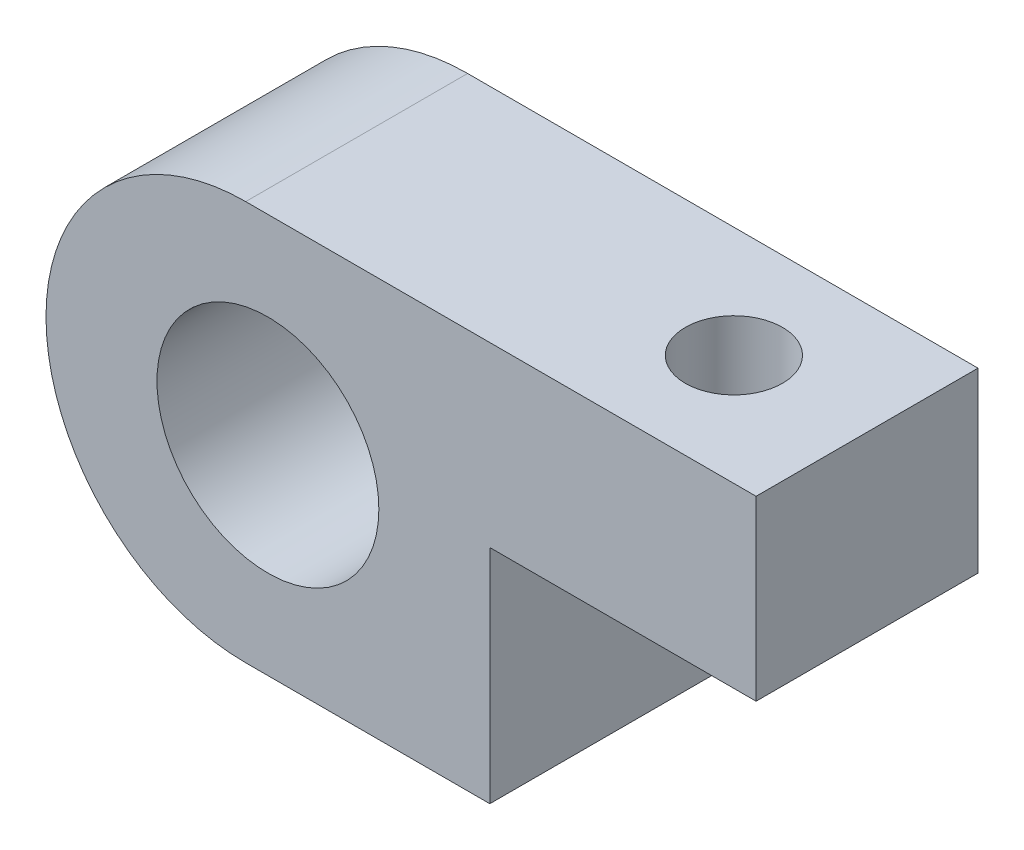
ISO-10303-21;
HEADER;
FILE_DESCRIPTION(('STEP AP214'),'2;1');
FILE_NAME('part.step','',(''),(''),'','','');
FILE_SCHEMA(('AUTOMOTIVE_DESIGN { 1 0 10303 214 1 1 1 1 }'));
ENDSEC;
DATA;
#1=APPLICATION_CONTEXT('core data for automotive mechanical design processes');
#2=APPLICATION_PROTOCOL_DEFINITION('international standard','automotive_design',2000,#1);
#3=PRODUCT_CONTEXT('',#1,'mechanical');
#4=PRODUCT('Part','Part','',(#3));
#5=PRODUCT_RELATED_PRODUCT_CATEGORY('part','',(#4));
#6=PRODUCT_DEFINITION_FORMATION('','',#4);
#7=PRODUCT_DEFINITION_CONTEXT('part definition',#1,'design');
#8=PRODUCT_DEFINITION('design','',#6,#7);
#9=PRODUCT_DEFINITION_SHAPE('','',#8);
#10=(LENGTH_UNIT() NAMED_UNIT(*) SI_UNIT(.MILLI.,.METRE.));
#11=(NAMED_UNIT(*) PLANE_ANGLE_UNIT() SI_UNIT($,.RADIAN.));
#12=(NAMED_UNIT(*) SI_UNIT($,.STERADIAN.) SOLID_ANGLE_UNIT());
#13=UNCERTAINTY_MEASURE_WITH_UNIT(LENGTH_MEASURE(1.E-05),#10,'distance_accuracy_value','');
#14=(GEOMETRIC_REPRESENTATION_CONTEXT(3) GLOBAL_UNCERTAINTY_ASSIGNED_CONTEXT((#13)) GLOBAL_UNIT_ASSIGNED_CONTEXT((#10,
#11,#12)) REPRESENTATION_CONTEXT('',''));
#15=CARTESIAN_POINT('',(0.,0.,0.));
#16=DIRECTION('',(0.,0.,1.));
#17=DIRECTION('',(1.,0.,0.));
#18=AXIS2_PLACEMENT_3D('',#15,#16,#17);
#19=CARTESIAN_POINT('',(0.,0.,12.7));
#20=DIRECTION('',(0.,0.,-1.));
#21=DIRECTION('',(-1.,0.,0.));
#22=AXIS2_PLACEMENT_3D('',#19,#20,#21);
#23=PLANE('',#22);
#24=CARTESIAN_POINT('',(11.43,-11.43,12.7));
#25=DIRECTION('',(0.,0.,-1.));
#26=DIRECTION('',(-1.,0.,0.));
#27=AXIS2_PLACEMENT_3D('',#24,#25,#26);
#28=CIRCLE('',#27,11.43);
#29=CARTESIAN_POINT('',(11.43,0.,12.7));
#30=VERTEX_POINT('',#29);
#31=CARTESIAN_POINT('',(0.,-11.43,12.7));
#32=VERTEX_POINT('',#31);
#33=EDGE_CURVE('E57',#30,#32,#28,.F.);
#34=ORIENTED_EDGE('',*,*,#33,.T.);
#35=CARTESIAN_POINT('',(11.43,-11.4300000000004,12.7));
#36=DIRECTION('',(0.,0.,-1.));
#37=DIRECTION('',(-1.,0.,0.));
#38=AXIS2_PLACEMENT_3D('',#35,#36,#37);
#39=CIRCLE('',#38,11.43);
#40=CARTESIAN_POINT('',(11.43,-22.8600000000004,12.7));
#41=VERTEX_POINT('',#40);
#42=EDGE_CURVE('E45',#32,#41,#39,.F.);
#43=ORIENTED_EDGE('',*,*,#42,.T.);
#44=DIRECTION('',(1.,0.,0.));
#45=VECTOR('',#44,1.);
#46=CARTESIAN_POINT('',(25.4,-22.8600000000004,12.7));
#47=LINE('',#46,#45);
#48=CARTESIAN_POINT('',(25.4,-22.8600000000004,12.7));
#49=VERTEX_POINT('',#48);
#50=EDGE_CURVE('E94',#41,#49,#47,.T.);
#51=ORIENTED_EDGE('',*,*,#50,.T.);
#52=DIRECTION('',(0.,1.,0.));
#53=VECTOR('',#52,1.);
#54=CARTESIAN_POINT('',(25.4,-10.1600000000004,12.7));
#55=LINE('',#54,#53);
#56=CARTESIAN_POINT('',(25.4,-10.1600000000004,12.7));
#57=VERTEX_POINT('',#56);
#58=EDGE_CURVE('E98',#49,#57,#55,.T.);
#59=ORIENTED_EDGE('',*,*,#58,.T.);
#60=DIRECTION('',(1.,0.,0.));
#61=VECTOR('',#60,1.);
#62=CARTESIAN_POINT('',(40.64,-10.16,12.7));
#63=LINE('',#62,#61);
#64=CARTESIAN_POINT('',(40.64,-10.16,12.7));
#65=VERTEX_POINT('',#64);
#66=EDGE_CURVE('E119',#57,#65,#63,.T.);
#67=ORIENTED_EDGE('',*,*,#66,.T.);
#68=DIRECTION('',(0.,1.,0.));
#69=VECTOR('',#68,1.);
#70=CARTESIAN_POINT('',(40.64,0.,12.7));
#71=LINE('',#70,#69);
#72=CARTESIAN_POINT('',(40.64,0.,12.7));
#73=VERTEX_POINT('',#72);
#74=EDGE_CURVE('E121',#65,#73,#71,.T.);
#75=ORIENTED_EDGE('',*,*,#74,.T.);
#76=DIRECTION('',(-1.,0.,0.));
#77=VECTOR('',#76,1.);
#78=CARTESIAN_POINT('',(0.,0.,12.7));
#79=LINE('',#78,#77);
#80=EDGE_CURVE('E126',#73,#30,#79,.T.);
#81=ORIENTED_EDGE('',*,*,#80,.T.);
#82=EDGE_LOOP('',(#34,#43,#51,#59,#67,#75,#81));
#83=FACE_BOUND('',#82,.T.);
#84=CARTESIAN_POINT('',(12.7,-11.4300000000004,12.7));
#85=DIRECTION('',(0.,0.,1.));
#86=DIRECTION('',(1.,0.,0.));
#87=AXIS2_PLACEMENT_3D('',#84,#85,#86);
#88=CIRCLE('',#87,6.35);
#89=CARTESIAN_POINT('',(19.05,-11.4300000000004,12.7));
#90=VERTEX_POINT('',#89);
#91=EDGE_CURVE('E131',#90,#90,#88,.T.);
#92=ORIENTED_EDGE('',*,*,#91,.F.);
#93=EDGE_LOOP('',(#92));
#94=FACE_BOUND('',#93,.T.);
#95=ADVANCED_FACE('F36',(#83,#94),#23,.F.);
#96=CARTESIAN_POINT('',(0.,0.,0.));
#97=DIRECTION('',(0.,0.,-1.));
#98=DIRECTION('',(-1.,0.,0.));
#99=AXIS2_PLACEMENT_3D('',#96,#97,#98);
#100=PLANE('',#99);
#101=DIRECTION('',(1.,0.,0.));
#102=VECTOR('',#101,1.);
#103=CARTESIAN_POINT('',(25.4,-22.8600000000004,0.));
#104=LINE('',#103,#102);
#105=CARTESIAN_POINT('',(11.43,-22.8600000000004,0.));
#106=VERTEX_POINT('',#105);
#107=CARTESIAN_POINT('',(25.4,-22.8600000000004,0.));
#108=VERTEX_POINT('',#107);
#109=EDGE_CURVE('E110',#106,#108,#104,.T.);
#110=ORIENTED_EDGE('',*,*,#109,.F.);
#111=CARTESIAN_POINT('',(11.43,-11.4300000000004,0.));
#112=DIRECTION('',(0.,0.,-1.));
#113=DIRECTION('',(-1.,0.,0.));
#114=AXIS2_PLACEMENT_3D('',#111,#112,#113);
#115=CIRCLE('',#114,11.43);
#116=CARTESIAN_POINT('',(0.,-11.43,0.));
#117=VERTEX_POINT('',#116);
#118=EDGE_CURVE('E147',#106,#117,#115,.T.);
#119=ORIENTED_EDGE('',*,*,#118,.T.);
#120=CARTESIAN_POINT('',(11.43,-11.43,0.));
#121=DIRECTION('',(0.,0.,-1.));
#122=DIRECTION('',(-1.,0.,0.));
#123=AXIS2_PLACEMENT_3D('',#120,#121,#122);
#124=CIRCLE('',#123,11.43);
#125=CARTESIAN_POINT('',(11.43,0.,0.));
#126=VERTEX_POINT('',#125);
#127=EDGE_CURVE('E145',#117,#126,#124,.T.);
#128=ORIENTED_EDGE('',*,*,#127,.T.);
#129=DIRECTION('',(-1.,0.,0.));
#130=VECTOR('',#129,1.);
#131=CARTESIAN_POINT('',(0.,0.,0.));
#132=LINE('',#131,#130);
#133=CARTESIAN_POINT('',(40.64,0.,0.));
#134=VERTEX_POINT('',#133);
#135=EDGE_CURVE('E104',#134,#126,#132,.T.);
#136=ORIENTED_EDGE('',*,*,#135,.F.);
#137=DIRECTION('',(0.,1.,0.));
#138=VECTOR('',#137,1.);
#139=CARTESIAN_POINT('',(40.64,0.,0.));
#140=LINE('',#139,#138);
#141=CARTESIAN_POINT('',(40.64,-10.16,0.));
#142=VERTEX_POINT('',#141);
#143=EDGE_CURVE('E135',#142,#134,#140,.T.);
#144=ORIENTED_EDGE('',*,*,#143,.F.);
#145=DIRECTION('',(1.,0.,0.));
#146=VECTOR('',#145,1.);
#147=CARTESIAN_POINT('',(40.64,-10.16,0.));
#148=LINE('',#147,#146);
#149=CARTESIAN_POINT('',(25.4,-10.1600000000004,0.));
#150=VERTEX_POINT('',#149);
#151=EDGE_CURVE('E133',#150,#142,#148,.T.);
#152=ORIENTED_EDGE('',*,*,#151,.F.);
#153=DIRECTION('',(0.,1.,0.));
#154=VECTOR('',#153,1.);
#155=CARTESIAN_POINT('',(25.4,-10.1600000000004,0.));
#156=LINE('',#155,#154);
#157=EDGE_CURVE('E130',#108,#150,#156,.T.);
#158=ORIENTED_EDGE('',*,*,#157,.F.);
#159=EDGE_LOOP('',(#110,#119,#128,#136,#144,#152,#158));
#160=FACE_BOUND('',#159,.T.);
#161=CARTESIAN_POINT('',(12.7,-11.4300000000004,0.));
#162=DIRECTION('',(0.,0.,1.));
#163=DIRECTION('',(1.,0.,0.));
#164=AXIS2_PLACEMENT_3D('',#161,#162,#163);
#165=CIRCLE('',#164,6.35);
#166=CARTESIAN_POINT('',(19.05,-11.4300000000004,0.));
#167=VERTEX_POINT('',#166);
#168=EDGE_CURVE('E159',#167,#167,#165,.T.);
#169=ORIENTED_EDGE('',*,*,#168,.T.);
#170=EDGE_LOOP('',(#169));
#171=FACE_BOUND('',#170,.T.);
#172=ADVANCED_FACE('F152',(#160,#171),#100,.T.);
#173=CARTESIAN_POINT('',(25.4,-22.8600000000004,12.7));
#174=DIRECTION('',(0.,1.,0.));
#175=DIRECTION('',(0.,0.,1.));
#176=AXIS2_PLACEMENT_3D('',#173,#174,#175);
#177=PLANE('',#176);
#178=ORIENTED_EDGE('',*,*,#50,.F.);
#179=DIRECTION('',(0.,0.,-1.));
#180=VECTOR('',#179,1.);
#181=CARTESIAN_POINT('',(11.43,-22.8600000000004,12.7));
#182=LINE('',#181,#180);
#183=EDGE_CURVE('E113',#41,#106,#182,.T.);
#184=ORIENTED_EDGE('',*,*,#183,.T.);
#185=ORIENTED_EDGE('',*,*,#109,.T.);
#186=DIRECTION('',(0.,0.,-1.));
#187=VECTOR('',#186,1.);
#188=CARTESIAN_POINT('',(25.4,-22.8600000000004,12.7));
#189=LINE('',#188,#187);
#190=EDGE_CURVE('E107',#49,#108,#189,.T.);
#191=ORIENTED_EDGE('',*,*,#190,.F.);
#192=EDGE_LOOP('',(#178,#184,#185,#191));
#193=FACE_BOUND('',#192,.T.);
#194=ADVANCED_FACE('F108',(#193),#177,.F.);
#195=CARTESIAN_POINT('',(25.4,-10.1600000000004,12.7));
#196=DIRECTION('',(-1.,0.,0.));
#197=DIRECTION('',(0.,-1.,0.));
#198=AXIS2_PLACEMENT_3D('',#195,#196,#197);
#199=PLANE('',#198);
#200=ORIENTED_EDGE('',*,*,#157,.T.);
#201=DIRECTION('',(0.,0.,-1.));
#202=VECTOR('',#201,1.);
#203=CARTESIAN_POINT('',(25.4,-10.1600000000004,12.7));
#204=LINE('',#203,#202);
#205=EDGE_CURVE('E114',#57,#150,#204,.T.);
#206=ORIENTED_EDGE('',*,*,#205,.F.);
#207=ORIENTED_EDGE('',*,*,#58,.F.);
#208=ORIENTED_EDGE('',*,*,#190,.T.);
#209=EDGE_LOOP('',(#200,#206,#207,#208));
#210=FACE_BOUND('',#209,.T.);
#211=ADVANCED_FACE('F116',(#210),#199,.F.);
#212=CARTESIAN_POINT('',(40.64,-10.16,12.7));
#213=DIRECTION('',(0.,1.,0.));
#214=DIRECTION('',(-1.,0.,0.));
#215=AXIS2_PLACEMENT_3D('',#212,#213,#214);
#216=PLANE('',#215);
#217=CARTESIAN_POINT('',(33.02,-10.1600000000002,6.35));
#218=DIRECTION('',(0.,1.,0.));
#219=DIRECTION('',(-1.,0.,0.));
#220=AXIS2_PLACEMENT_3D('',#217,#218,#219);
#221=CIRCLE('',#220,2.77812499999999);
#222=CARTESIAN_POINT('',(30.241875,-10.1600000000002,6.35));
#223=VERTEX_POINT('',#222);
#224=EDGE_CURVE('E160',#223,#223,#221,.T.);
#225=ORIENTED_EDGE('',*,*,#224,.T.);
#226=EDGE_LOOP('',(#225));
#227=FACE_BOUND('',#226,.T.);
#228=ORIENTED_EDGE('',*,*,#151,.T.);
#229=DIRECTION('',(0.,0.,-1.));
#230=VECTOR('',#229,1.);
#231=CARTESIAN_POINT('',(40.64,-10.16,12.7));
#232=LINE('',#231,#230);
#233=EDGE_CURVE('E140',#65,#142,#232,.T.);
#234=ORIENTED_EDGE('',*,*,#233,.F.);
#235=ORIENTED_EDGE('',*,*,#66,.F.);
#236=ORIENTED_EDGE('',*,*,#205,.T.);
#237=EDGE_LOOP('',(#228,#234,#235,#236));
#238=FACE_BOUND('',#237,.T.);
#239=ADVANCED_FACE('F191',(#227,#238),#216,.F.);
#240=CARTESIAN_POINT('',(40.64,0.,12.7));
#241=DIRECTION('',(-1.,0.,0.));
#242=DIRECTION('',(0.,-1.,0.));
#243=AXIS2_PLACEMENT_3D('',#240,#241,#242);
#244=PLANE('',#243);
#245=ORIENTED_EDGE('',*,*,#143,.T.);
#246=DIRECTION('',(0.,0.,-1.));
#247=VECTOR('',#246,1.);
#248=CARTESIAN_POINT('',(40.64,0.,12.7));
#249=LINE('',#248,#247);
#250=EDGE_CURVE('E128',#73,#134,#249,.T.);
#251=ORIENTED_EDGE('',*,*,#250,.F.);
#252=ORIENTED_EDGE('',*,*,#74,.F.);
#253=ORIENTED_EDGE('',*,*,#233,.T.);
#254=EDGE_LOOP('',(#245,#251,#252,#253));
#255=FACE_BOUND('',#254,.T.);
#256=ADVANCED_FACE('F187',(#255),#244,.F.);
#257=CARTESIAN_POINT('',(0.,0.,12.7));
#258=DIRECTION('',(0.,-1.,0.));
#259=DIRECTION('',(0.,0.,-1.));
#260=AXIS2_PLACEMENT_3D('',#257,#258,#259);
#261=PLANE('',#260);
#262=CARTESIAN_POINT('',(33.02,0.,6.35));
#263=DIRECTION('',(0.,1.,0.));
#264=DIRECTION('',(0.,0.,1.));
#265=AXIS2_PLACEMENT_3D('',#262,#263,#264);
#266=CIRCLE('',#265,2.77812499999999);
#267=CARTESIAN_POINT('',(33.02,0.,9.12812499999999));
#268=VERTEX_POINT('',#267);
#269=EDGE_CURVE('E163',#268,#268,#266,.T.);
#270=ORIENTED_EDGE('',*,*,#269,.F.);
#271=EDGE_LOOP('',(#270));
#272=FACE_BOUND('',#271,.T.);
#273=ORIENTED_EDGE('',*,*,#135,.T.);
#274=DIRECTION('',(0.,0.,-1.));
#275=VECTOR('',#274,1.);
#276=CARTESIAN_POINT('',(11.43,0.,12.7));
#277=LINE('',#276,#275);
#278=EDGE_CURVE('E11',#126,#30,#277,.F.);
#279=ORIENTED_EDGE('',*,*,#278,.T.);
#280=ORIENTED_EDGE('',*,*,#80,.F.);
#281=ORIENTED_EDGE('',*,*,#250,.T.);
#282=EDGE_LOOP('',(#273,#279,#280,#281));
#283=FACE_BOUND('',#282,.T.);
#284=ADVANCED_FACE('F184',(#272,#283),#261,.F.);
#285=CARTESIAN_POINT('',(12.7,-11.4300000000004,12.7));
#286=DIRECTION('',(0.,0.,-1.));
#287=DIRECTION('',(-1.,0.,0.));
#288=AXIS2_PLACEMENT_3D('',#285,#286,#287);
#289=CYLINDRICAL_SURFACE('',#288,6.35);
#290=ORIENTED_EDGE('',*,*,#91,.T.);
#291=EDGE_LOOP('',(#290));
#292=FACE_BOUND('',#291,.T.);
#293=ORIENTED_EDGE('',*,*,#168,.F.);
#294=EDGE_LOOP('',(#293));
#295=FACE_BOUND('',#294,.T.);
#296=ADVANCED_FACE('F173',(#292,#295),#289,.F.);
#297=CARTESIAN_POINT('',(11.43,-11.43,12.7));
#298=DIRECTION('',(0.,0.,-1.));
#299=DIRECTION('',(-1.,0.,0.));
#300=AXIS2_PLACEMENT_3D('',#297,#298,#299);
#301=CYLINDRICAL_SURFACE('',#300,11.43);
#302=DIRECTION('',(0.,0.,-1.));
#303=VECTOR('',#302,1.);
#304=CARTESIAN_POINT('',(0.,-11.43,12.7));
#305=LINE('',#304,#303);
#306=EDGE_CURVE('E40',#32,#117,#305,.T.);
#307=ORIENTED_EDGE('',*,*,#306,.F.);
#308=ORIENTED_EDGE('',*,*,#33,.F.);
#309=ORIENTED_EDGE('',*,*,#278,.F.);
#310=ORIENTED_EDGE('',*,*,#127,.F.);
#311=EDGE_LOOP('',(#307,#308,#309,#310));
#312=FACE_BOUND('',#311,.T.);
#313=ADVANCED_FACE('F38',(#312),#301,.T.);
#314=CARTESIAN_POINT('',(11.43,-11.4300000000004,12.7));
#315=DIRECTION('',(0.,0.,-1.));
#316=DIRECTION('',(-1.,0.,0.));
#317=AXIS2_PLACEMENT_3D('',#314,#315,#316);
#318=CYLINDRICAL_SURFACE('',#317,11.43);
#319=ORIENTED_EDGE('',*,*,#42,.F.);
#320=ORIENTED_EDGE('',*,*,#306,.T.);
#321=ORIENTED_EDGE('',*,*,#118,.F.);
#322=ORIENTED_EDGE('',*,*,#183,.F.);
#323=EDGE_LOOP('',(#319,#320,#321,#322));
#324=FACE_BOUND('',#323,.T.);
#325=ADVANCED_FACE('F158',(#324),#318,.T.);
#326=CARTESIAN_POINT('',(33.02,0.,6.35));
#327=DIRECTION('',(0.,1.,0.));
#328=DIRECTION('',(0.,0.,1.));
#329=AXIS2_PLACEMENT_3D('',#326,#327,#328);
#330=CYLINDRICAL_SURFACE('',#329,2.77812499999999);
#331=ORIENTED_EDGE('',*,*,#269,.T.);
#332=EDGE_LOOP('',(#331));
#333=FACE_BOUND('',#332,.T.);
#334=ORIENTED_EDGE('',*,*,#224,.F.);
#335=EDGE_LOOP('',(#334));
#336=FACE_BOUND('',#335,.T.);
#337=ADVANCED_FACE('F199',(#333,#336),#330,.F.);
#338=CLOSED_SHELL('',(#95,#172,#194,#211,#239,#256,#284,#296,#313,#325,#337));
#339=MANIFOLD_SOLID_BREP('B2',#338);
#340=ADVANCED_BREP_SHAPE_REPRESENTATION('',(#18,#339),#14);
#341=SHAPE_DEFINITION_REPRESENTATION(#9,#340);
ENDSEC;
END-ISO-10303-21;
